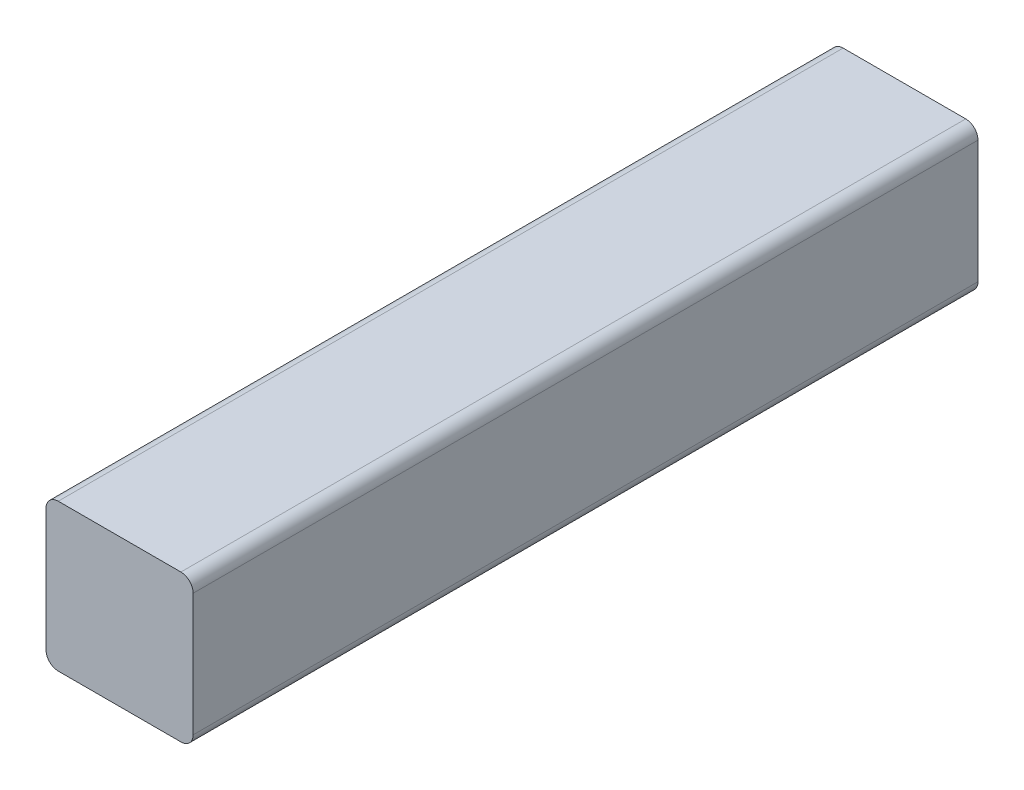
ISO-10303-21;
HEADER;
FILE_DESCRIPTION(('STEP AP214'),'2;1');
FILE_NAME('part.step','',(''),(''),'','','');
FILE_SCHEMA(('AUTOMOTIVE_DESIGN { 1 0 10303 214 1 1 1 1 }'));
ENDSEC;
DATA;
#1=APPLICATION_CONTEXT('core data for automotive mechanical design processes');
#2=APPLICATION_PROTOCOL_DEFINITION('international standard','automotive_design',2000,#1);
#3=PRODUCT_CONTEXT('',#1,'mechanical');
#4=PRODUCT('Part','Part','',(#3));
#5=PRODUCT_RELATED_PRODUCT_CATEGORY('part','',(#4));
#6=PRODUCT_DEFINITION_FORMATION('','',#4);
#7=PRODUCT_DEFINITION_CONTEXT('part definition',#1,'design');
#8=PRODUCT_DEFINITION('design','',#6,#7);
#9=PRODUCT_DEFINITION_SHAPE('','',#8);
#10=(LENGTH_UNIT() NAMED_UNIT(*) SI_UNIT(.MILLI.,.METRE.));
#11=(NAMED_UNIT(*) PLANE_ANGLE_UNIT() SI_UNIT($,.RADIAN.));
#12=(NAMED_UNIT(*) SI_UNIT($,.STERADIAN.) SOLID_ANGLE_UNIT());
#13=UNCERTAINTY_MEASURE_WITH_UNIT(LENGTH_MEASURE(1.E-05),#10,'distance_accuracy_value','');
#14=(GEOMETRIC_REPRESENTATION_CONTEXT(3) GLOBAL_UNCERTAINTY_ASSIGNED_CONTEXT((#13)) GLOBAL_UNIT_ASSIGNED_CONTEXT((#10,
#11,#12)) REPRESENTATION_CONTEXT('',''));
#15=CARTESIAN_POINT('',(0.,0.,0.));
#16=DIRECTION('',(0.,0.,1.));
#17=DIRECTION('',(1.,0.,0.));
#18=AXIS2_PLACEMENT_3D('',#15,#16,#17);
#19=CARTESIAN_POINT('',(19.05,-19.05,203.2));
#20=DIRECTION('',(-1.,0.,0.));
#21=DIRECTION('',(0.,0.,1.));
#22=AXIS2_PLACEMENT_3D('',#19,#20,#21);
#23=PLANE('',#22);
#24=DIRECTION('',(0.,1.,0.));
#25=VECTOR('',#24,1.);
#26=CARTESIAN_POINT('',(19.05,-19.05,203.2));
#27=LINE('',#26,#25);
#28=CARTESIAN_POINT('',(19.05,-15.875,203.2));
#29=VERTEX_POINT('',#28);
#30=CARTESIAN_POINT('',(19.05,15.875,203.2));
#31=VERTEX_POINT('',#30);
#32=EDGE_CURVE('E134',#29,#31,#27,.T.);
#33=ORIENTED_EDGE('',*,*,#32,.F.);
#34=DIRECTION('',(0.,0.,-1.));
#35=VECTOR('',#34,1.);
#36=CARTESIAN_POINT('',(19.05,-15.875,203.2));
#37=LINE('',#36,#35);
#38=CARTESIAN_POINT('',(19.05,-15.875,0.));
#39=VERTEX_POINT('',#38);
#40=EDGE_CURVE('E11',#29,#39,#37,.T.);
#41=ORIENTED_EDGE('',*,*,#40,.T.);
#42=DIRECTION('',(0.,1.,0.));
#43=VECTOR('',#42,1.);
#44=CARTESIAN_POINT('',(19.05,-19.05,0.));
#45=LINE('',#44,#43);
#46=CARTESIAN_POINT('',(19.05,15.875,0.));
#47=VERTEX_POINT('',#46);
#48=EDGE_CURVE('E136',#39,#47,#45,.T.);
#49=ORIENTED_EDGE('',*,*,#48,.T.);
#50=DIRECTION('',(0.,0.,-1.));
#51=VECTOR('',#50,1.);
#52=CARTESIAN_POINT('',(19.05,15.875,203.2));
#53=LINE('',#52,#51);
#54=EDGE_CURVE('E47',#47,#31,#53,.F.);
#55=ORIENTED_EDGE('',*,*,#54,.T.);
#56=EDGE_LOOP('',(#33,#41,#49,#55));
#57=FACE_BOUND('',#56,.T.);
#58=ADVANCED_FACE('F39',(#57),#23,.F.);
#59=CARTESIAN_POINT('',(-19.05,19.05,203.2));
#60=DIRECTION('',(0.,-1.,0.));
#61=DIRECTION('',(0.,0.,-1.));
#62=AXIS2_PLACEMENT_3D('',#59,#60,#61);
#63=PLANE('',#62);
#64=DIRECTION('',(-1.,0.,0.));
#65=VECTOR('',#64,1.);
#66=CARTESIAN_POINT('',(-19.05,19.05,0.));
#67=LINE('',#66,#65);
#68=CARTESIAN_POINT('',(15.875,19.05,0.));
#69=VERTEX_POINT('',#68);
#70=CARTESIAN_POINT('',(-15.875,19.05,0.));
#71=VERTEX_POINT('',#70);
#72=EDGE_CURVE('E132',#69,#71,#67,.T.);
#73=ORIENTED_EDGE('',*,*,#72,.T.);
#74=DIRECTION('',(0.,0.,-1.));
#75=VECTOR('',#74,1.);
#76=CARTESIAN_POINT('',(-15.875,19.05,203.2));
#77=LINE('',#76,#75);
#78=CARTESIAN_POINT('',(-15.875,19.05,203.2));
#79=VERTEX_POINT('',#78);
#80=EDGE_CURVE('E111',#71,#79,#77,.F.);
#81=ORIENTED_EDGE('',*,*,#80,.T.);
#82=DIRECTION('',(-1.,0.,0.));
#83=VECTOR('',#82,1.);
#84=CARTESIAN_POINT('',(-19.05,19.05,203.2));
#85=LINE('',#84,#83);
#86=CARTESIAN_POINT('',(15.875,19.05,203.2));
#87=VERTEX_POINT('',#86);
#88=EDGE_CURVE('E172',#87,#79,#85,.T.);
#89=ORIENTED_EDGE('',*,*,#88,.F.);
#90=DIRECTION('',(0.,0.,-1.));
#91=VECTOR('',#90,1.);
#92=CARTESIAN_POINT('',(15.875,19.05,203.2));
#93=LINE('',#92,#91);
#94=EDGE_CURVE('E116',#87,#69,#93,.T.);
#95=ORIENTED_EDGE('',*,*,#94,.T.);
#96=EDGE_LOOP('',(#73,#81,#89,#95));
#97=FACE_BOUND('',#96,.T.);
#98=ADVANCED_FACE('F176',(#97),#63,.F.);
#99=CARTESIAN_POINT('',(-19.05,-19.05,203.2));
#100=DIRECTION('',(1.,0.,0.));
#101=DIRECTION('',(0.,0.,-1.));
#102=AXIS2_PLACEMENT_3D('',#99,#100,#101);
#103=PLANE('',#102);
#104=DIRECTION('',(0.,-1.,0.));
#105=VECTOR('',#104,1.);
#106=CARTESIAN_POINT('',(-19.05,-19.05,203.2));
#107=LINE('',#106,#105);
#108=CARTESIAN_POINT('',(-19.05,15.875,203.2));
#109=VERTEX_POINT('',#108);
#110=CARTESIAN_POINT('',(-19.05,-15.875,203.2));
#111=VERTEX_POINT('',#110);
#112=EDGE_CURVE('E125',#109,#111,#107,.T.);
#113=ORIENTED_EDGE('',*,*,#112,.F.);
#114=DIRECTION('',(0.,0.,-1.));
#115=VECTOR('',#114,1.);
#116=CARTESIAN_POINT('',(-19.05,15.875,203.2));
#117=LINE('',#116,#115);
#118=CARTESIAN_POINT('',(-19.05,15.875,0.));
#119=VERTEX_POINT('',#118);
#120=EDGE_CURVE('E110',#109,#119,#117,.T.);
#121=ORIENTED_EDGE('',*,*,#120,.T.);
#122=DIRECTION('',(0.,-1.,0.));
#123=VECTOR('',#122,1.);
#124=CARTESIAN_POINT('',(-19.05,-19.05,0.));
#125=LINE('',#124,#123);
#126=CARTESIAN_POINT('',(-19.05,-15.875,0.));
#127=VERTEX_POINT('',#126);
#128=EDGE_CURVE('E123',#119,#127,#125,.T.);
#129=ORIENTED_EDGE('',*,*,#128,.T.);
#130=DIRECTION('',(0.,0.,-1.));
#131=VECTOR('',#130,1.);
#132=CARTESIAN_POINT('',(-19.05,-15.875,203.2));
#133=LINE('',#132,#131);
#134=EDGE_CURVE('E127',#127,#111,#133,.F.);
#135=ORIENTED_EDGE('',*,*,#134,.T.);
#136=EDGE_LOOP('',(#113,#121,#129,#135));
#137=FACE_BOUND('',#136,.T.);
#138=ADVANCED_FACE('F122',(#137),#103,.F.);
#139=CARTESIAN_POINT('',(-19.05,-19.05,203.2));
#140=DIRECTION('',(0.,1.,0.));
#141=DIRECTION('',(0.,0.,1.));
#142=AXIS2_PLACEMENT_3D('',#139,#140,#141);
#143=PLANE('',#142);
#144=DIRECTION('',(1.,0.,0.));
#145=VECTOR('',#144,1.);
#146=CARTESIAN_POINT('',(-19.05,-19.05,203.2));
#147=LINE('',#146,#145);
#148=CARTESIAN_POINT('',(-15.875,-19.05,203.2));
#149=VERTEX_POINT('',#148);
#150=CARTESIAN_POINT('',(15.875,-19.05,203.2));
#151=VERTEX_POINT('',#150);
#152=EDGE_CURVE('E140',#149,#151,#147,.T.);
#153=ORIENTED_EDGE('',*,*,#152,.F.);
#154=DIRECTION('',(0.,0.,-1.));
#155=VECTOR('',#154,1.);
#156=CARTESIAN_POINT('',(-15.875,-19.05,203.2));
#157=LINE('',#156,#155);
#158=CARTESIAN_POINT('',(-15.875,-19.05,0.));
#159=VERTEX_POINT('',#158);
#160=EDGE_CURVE('E157',#149,#159,#157,.T.);
#161=ORIENTED_EDGE('',*,*,#160,.T.);
#162=DIRECTION('',(1.,0.,0.));
#163=VECTOR('',#162,1.);
#164=CARTESIAN_POINT('',(-19.05,-19.05,0.));
#165=LINE('',#164,#163);
#166=CARTESIAN_POINT('',(15.875,-19.05,0.));
#167=VERTEX_POINT('',#166);
#168=EDGE_CURVE('E131',#159,#167,#165,.T.);
#169=ORIENTED_EDGE('',*,*,#168,.T.);
#170=DIRECTION('',(0.,0.,-1.));
#171=VECTOR('',#170,1.);
#172=CARTESIAN_POINT('',(15.875,-19.05,203.2));
#173=LINE('',#172,#171);
#174=EDGE_CURVE('E54',#167,#151,#173,.F.);
#175=ORIENTED_EDGE('',*,*,#174,.T.);
#176=EDGE_LOOP('',(#153,#161,#169,#175));
#177=FACE_BOUND('',#176,.T.);
#178=ADVANCED_FACE('F183',(#177),#143,.F.);
#179=CARTESIAN_POINT('',(0.,0.,203.2));
#180=DIRECTION('',(0.,0.,-1.));
#181=DIRECTION('',(-1.,0.,0.));
#182=AXIS2_PLACEMENT_3D('',#179,#180,#181);
#183=PLANE('',#182);
#184=ORIENTED_EDGE('',*,*,#88,.T.);
#185=CARTESIAN_POINT('',(-15.875,15.875,203.2));
#186=DIRECTION('',(0.,0.,-1.));
#187=DIRECTION('',(-1.,0.,0.));
#188=AXIS2_PLACEMENT_3D('',#185,#186,#187);
#189=CIRCLE('',#188,3.175);
#190=EDGE_CURVE('E154',#79,#109,#189,.F.);
#191=ORIENTED_EDGE('',*,*,#190,.T.);
#192=ORIENTED_EDGE('',*,*,#112,.T.);
#193=CARTESIAN_POINT('',(-15.875,-15.875,203.2));
#194=DIRECTION('',(0.,0.,-1.));
#195=DIRECTION('',(-1.,0.,0.));
#196=AXIS2_PLACEMENT_3D('',#193,#194,#195);
#197=CIRCLE('',#196,3.175);
#198=EDGE_CURVE('E61',#111,#149,#197,.F.);
#199=ORIENTED_EDGE('',*,*,#198,.T.);
#200=ORIENTED_EDGE('',*,*,#152,.T.);
#201=CARTESIAN_POINT('',(15.875,-15.875,203.2));
#202=DIRECTION('',(0.,0.,-1.));
#203=DIRECTION('',(-1.,0.,0.));
#204=AXIS2_PLACEMENT_3D('',#201,#202,#203);
#205=CIRCLE('',#204,3.175);
#206=EDGE_CURVE('E151',#151,#29,#205,.F.);
#207=ORIENTED_EDGE('',*,*,#206,.T.);
#208=ORIENTED_EDGE('',*,*,#32,.T.);
#209=CARTESIAN_POINT('',(15.875,15.875,203.2));
#210=DIRECTION('',(0.,0.,-1.));
#211=DIRECTION('',(-1.,0.,0.));
#212=AXIS2_PLACEMENT_3D('',#209,#210,#211);
#213=CIRCLE('',#212,3.175);
#214=EDGE_CURVE('E149',#31,#87,#213,.F.);
#215=ORIENTED_EDGE('',*,*,#214,.T.);
#216=EDGE_LOOP('',(#184,#191,#192,#199,#200,#207,#208,#215));
#217=FACE_BOUND('',#216,.T.);
#218=ADVANCED_FACE('F169',(#217),#183,.F.);
#219=CARTESIAN_POINT('',(0.,0.,0.));
#220=DIRECTION('',(0.,0.,-1.));
#221=DIRECTION('',(-1.,0.,0.));
#222=AXIS2_PLACEMENT_3D('',#219,#220,#221);
#223=PLANE('',#222);
#224=ORIENTED_EDGE('',*,*,#128,.F.);
#225=CARTESIAN_POINT('',(-15.875,15.875,0.));
#226=DIRECTION('',(0.,0.,-1.));
#227=DIRECTION('',(-1.,0.,0.));
#228=AXIS2_PLACEMENT_3D('',#225,#226,#227);
#229=CIRCLE('',#228,3.175);
#230=EDGE_CURVE('E106',#119,#71,#229,.T.);
#231=ORIENTED_EDGE('',*,*,#230,.T.);
#232=ORIENTED_EDGE('',*,*,#72,.F.);
#233=CARTESIAN_POINT('',(15.875,15.875,0.));
#234=DIRECTION('',(0.,0.,-1.));
#235=DIRECTION('',(-1.,0.,0.));
#236=AXIS2_PLACEMENT_3D('',#233,#234,#235);
#237=CIRCLE('',#236,3.175);
#238=EDGE_CURVE('E126',#69,#47,#237,.T.);
#239=ORIENTED_EDGE('',*,*,#238,.T.);
#240=ORIENTED_EDGE('',*,*,#48,.F.);
#241=CARTESIAN_POINT('',(15.875,-15.875,0.));
#242=DIRECTION('',(0.,0.,-1.));
#243=DIRECTION('',(-1.,0.,0.));
#244=AXIS2_PLACEMENT_3D('',#241,#242,#243);
#245=CIRCLE('',#244,3.175);
#246=EDGE_CURVE('E143',#39,#167,#245,.T.);
#247=ORIENTED_EDGE('',*,*,#246,.T.);
#248=ORIENTED_EDGE('',*,*,#168,.F.);
#249=CARTESIAN_POINT('',(-15.875,-15.875,0.));
#250=DIRECTION('',(0.,0.,-1.));
#251=DIRECTION('',(-1.,0.,0.));
#252=AXIS2_PLACEMENT_3D('',#249,#250,#251);
#253=CIRCLE('',#252,3.175);
#254=EDGE_CURVE('E117',#159,#127,#253,.T.);
#255=ORIENTED_EDGE('',*,*,#254,.T.);
#256=EDGE_LOOP('',(#224,#231,#232,#239,#240,#247,#248,#255));
#257=FACE_BOUND('',#256,.T.);
#258=ADVANCED_FACE('F129',(#257),#223,.T.);
#259=CARTESIAN_POINT('',(-15.875,15.875,203.2));
#260=DIRECTION('',(0.,0.,-1.));
#261=DIRECTION('',(-1.,0.,0.));
#262=AXIS2_PLACEMENT_3D('',#259,#260,#261);
#263=CYLINDRICAL_SURFACE('',#262,3.175);
#264=ORIENTED_EDGE('',*,*,#190,.F.);
#265=ORIENTED_EDGE('',*,*,#80,.F.);
#266=ORIENTED_EDGE('',*,*,#230,.F.);
#267=ORIENTED_EDGE('',*,*,#120,.F.);
#268=EDGE_LOOP('',(#264,#265,#266,#267));
#269=FACE_BOUND('',#268,.T.);
#270=ADVANCED_FACE('F109',(#269),#263,.T.);
#271=CARTESIAN_POINT('',(-15.875,-15.875,203.2));
#272=DIRECTION('',(0.,0.,-1.));
#273=DIRECTION('',(-1.,0.,0.));
#274=AXIS2_PLACEMENT_3D('',#271,#272,#273);
#275=CYLINDRICAL_SURFACE('',#274,3.175);
#276=ORIENTED_EDGE('',*,*,#198,.F.);
#277=ORIENTED_EDGE('',*,*,#134,.F.);
#278=ORIENTED_EDGE('',*,*,#254,.F.);
#279=ORIENTED_EDGE('',*,*,#160,.F.);
#280=EDGE_LOOP('',(#276,#277,#278,#279));
#281=FACE_BOUND('',#280,.T.);
#282=ADVANCED_FACE('F182',(#281),#275,.T.);
#283=CARTESIAN_POINT('',(15.875,-15.875,203.2));
#284=DIRECTION('',(0.,0.,-1.));
#285=DIRECTION('',(-1.,0.,0.));
#286=AXIS2_PLACEMENT_3D('',#283,#284,#285);
#287=CYLINDRICAL_SURFACE('',#286,3.175);
#288=ORIENTED_EDGE('',*,*,#206,.F.);
#289=ORIENTED_EDGE('',*,*,#174,.F.);
#290=ORIENTED_EDGE('',*,*,#246,.F.);
#291=ORIENTED_EDGE('',*,*,#40,.F.);
#292=EDGE_LOOP('',(#288,#289,#290,#291));
#293=FACE_BOUND('',#292,.T.);
#294=ADVANCED_FACE('F185',(#293),#287,.T.);
#295=CARTESIAN_POINT('',(15.875,15.875,203.2));
#296=DIRECTION('',(0.,0.,-1.));
#297=DIRECTION('',(-1.,0.,0.));
#298=AXIS2_PLACEMENT_3D('',#295,#296,#297);
#299=CYLINDRICAL_SURFACE('',#298,3.175);
#300=ORIENTED_EDGE('',*,*,#214,.F.);
#301=ORIENTED_EDGE('',*,*,#54,.F.);
#302=ORIENTED_EDGE('',*,*,#238,.F.);
#303=ORIENTED_EDGE('',*,*,#94,.F.);
#304=EDGE_LOOP('',(#300,#301,#302,#303));
#305=FACE_BOUND('',#304,.T.);
#306=ADVANCED_FACE('F41',(#305),#299,.T.);
#307=CLOSED_SHELL('',(#58,#98,#138,#178,#218,#258,#270,#282,#294,#306));
#308=MANIFOLD_SOLID_BREP('B2',#307);
#309=ADVANCED_BREP_SHAPE_REPRESENTATION('',(#18,#308),#14);
#310=SHAPE_DEFINITION_REPRESENTATION(#9,#309);
ENDSEC;
END-ISO-10303-21;
